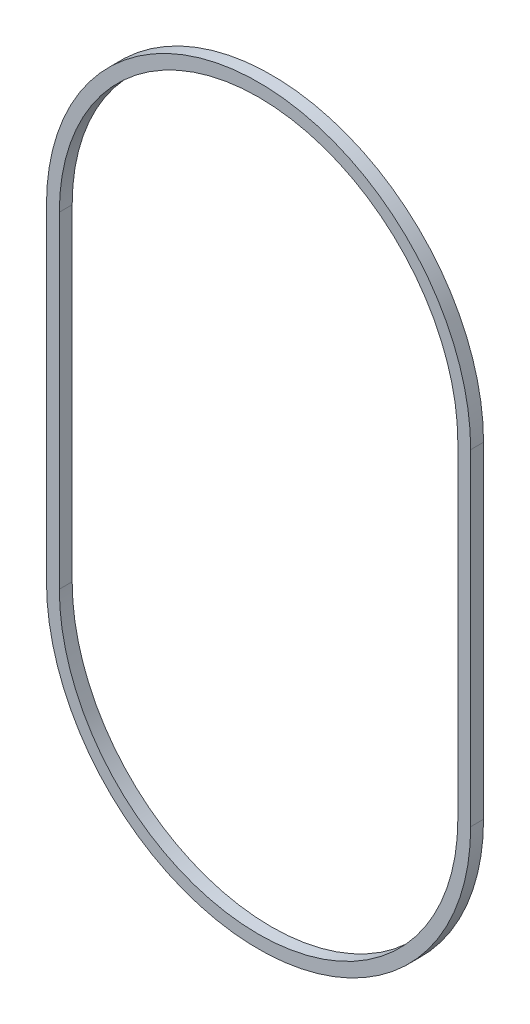
ISO-10303-21;
HEADER;
FILE_DESCRIPTION(('STEP AP214'),'2;1');
FILE_NAME('part.step','',(''),(''),'','','');
FILE_SCHEMA(('AUTOMOTIVE_DESIGN { 1 0 10303 214 1 1 1 1 }'));
ENDSEC;
DATA;
#1=APPLICATION_CONTEXT('core data for automotive mechanical design processes');
#2=APPLICATION_PROTOCOL_DEFINITION('international standard','automotive_design',2000,#1);
#3=PRODUCT_CONTEXT('',#1,'mechanical');
#4=PRODUCT('Part','Part','',(#3));
#5=PRODUCT_RELATED_PRODUCT_CATEGORY('part','',(#4));
#6=PRODUCT_DEFINITION_FORMATION('','',#4);
#7=PRODUCT_DEFINITION_CONTEXT('part definition',#1,'design');
#8=PRODUCT_DEFINITION('design','',#6,#7);
#9=PRODUCT_DEFINITION_SHAPE('','',#8);
#10=(LENGTH_UNIT() NAMED_UNIT(*) SI_UNIT(.MILLI.,.METRE.));
#11=(NAMED_UNIT(*) PLANE_ANGLE_UNIT() SI_UNIT($,.RADIAN.));
#12=(NAMED_UNIT(*) SI_UNIT($,.STERADIAN.) SOLID_ANGLE_UNIT());
#13=UNCERTAINTY_MEASURE_WITH_UNIT(LENGTH_MEASURE(1.E-05),#10,'distance_accuracy_value','');
#14=(GEOMETRIC_REPRESENTATION_CONTEXT(3) GLOBAL_UNCERTAINTY_ASSIGNED_CONTEXT((#13)) GLOBAL_UNIT_ASSIGNED_CONTEXT((#10,
#11,#12)) REPRESENTATION_CONTEXT('',''));
#15=CARTESIAN_POINT('',(0.,0.,0.));
#16=DIRECTION('',(0.,0.,1.));
#17=DIRECTION('',(1.,0.,0.));
#18=AXIS2_PLACEMENT_3D('',#15,#16,#17);
#19=CARTESIAN_POINT('',(0.,-31.75,2.5));
#20=DIRECTION('',(0.,0.,1.));
#21=DIRECTION('',(1.,0.,0.));
#22=AXIS2_PLACEMENT_3D('',#19,#20,#21);
#23=PLANE('',#22);
#24=CARTESIAN_POINT('',(0.,-31.75,2.5));
#25=DIRECTION('',(0.,0.,1.));
#26=DIRECTION('',(1.,0.,0.));
#27=AXIS2_PLACEMENT_3D('',#24,#25,#26);
#28=CIRCLE('',#27,41.25);
#29=CARTESIAN_POINT('',(-41.25,-31.75,2.5));
#30=VERTEX_POINT('',#29);
#31=CARTESIAN_POINT('',(41.25,-31.75,2.5));
#32=VERTEX_POINT('',#31);
#33=EDGE_CURVE('E140',#30,#32,#28,.T.);
#34=ORIENTED_EDGE('',*,*,#33,.T.);
#35=DIRECTION('',(0.,1.,0.));
#36=VECTOR('',#35,1.);
#37=CARTESIAN_POINT('',(41.25,-31.75,2.5));
#38=LINE('',#37,#36);
#39=CARTESIAN_POINT('',(41.25,31.75,2.5));
#40=VERTEX_POINT('',#39);
#41=EDGE_CURVE('E143',#32,#40,#38,.T.);
#42=ORIENTED_EDGE('',*,*,#41,.T.);
#43=CARTESIAN_POINT('',(0.,31.75,2.5));
#44=DIRECTION('',(0.,0.,1.));
#45=DIRECTION('',(1.,0.,0.));
#46=AXIS2_PLACEMENT_3D('',#43,#44,#45);
#47=CIRCLE('',#46,41.25);
#48=CARTESIAN_POINT('',(-41.25,31.75,2.5));
#49=VERTEX_POINT('',#48);
#50=EDGE_CURVE('E146',#40,#49,#47,.T.);
#51=ORIENTED_EDGE('',*,*,#50,.T.);
#52=DIRECTION('',(0.,-1.,0.));
#53=VECTOR('',#52,1.);
#54=CARTESIAN_POINT('',(-41.25,-31.75,2.5));
#55=LINE('',#54,#53);
#56=EDGE_CURVE('E148',#49,#30,#55,.T.);
#57=ORIENTED_EDGE('',*,*,#56,.T.);
#58=EDGE_LOOP('',(#34,#42,#51,#57));
#59=FACE_BOUND('',#58,.T.);
#60=DIRECTION('',(0.,1.,0.));
#61=VECTOR('',#60,1.);
#62=CARTESIAN_POINT('',(38.75,-31.75,2.5));
#63=LINE('',#62,#61);
#64=CARTESIAN_POINT('',(38.75,-31.75,2.5));
#65=VERTEX_POINT('',#64);
#66=CARTESIAN_POINT('',(38.75,31.75,2.5));
#67=VERTEX_POINT('',#66);
#68=EDGE_CURVE('E112',#65,#67,#63,.T.);
#69=ORIENTED_EDGE('',*,*,#68,.F.);
#70=CARTESIAN_POINT('',(0.,-31.75,2.5));
#71=DIRECTION('',(0.,0.,1.));
#72=DIRECTION('',(1.,0.,0.));
#73=AXIS2_PLACEMENT_3D('',#70,#71,#72);
#74=CIRCLE('',#73,38.75);
#75=CARTESIAN_POINT('',(-38.75,-31.75,2.5));
#76=VERTEX_POINT('',#75);
#77=EDGE_CURVE('E104',#76,#65,#74,.T.);
#78=ORIENTED_EDGE('',*,*,#77,.F.);
#79=DIRECTION('',(0.,-1.,0.));
#80=VECTOR('',#79,1.);
#81=CARTESIAN_POINT('',(-38.75,-31.75,2.5));
#82=LINE('',#81,#80);
#83=CARTESIAN_POINT('',(-38.75,31.75,2.5));
#84=VERTEX_POINT('',#83);
#85=EDGE_CURVE('E126',#84,#76,#82,.T.);
#86=ORIENTED_EDGE('',*,*,#85,.F.);
#87=CARTESIAN_POINT('',(0.,31.75,2.5));
#88=DIRECTION('',(0.,0.,1.));
#89=DIRECTION('',(1.,0.,0.));
#90=AXIS2_PLACEMENT_3D('',#87,#88,#89);
#91=CIRCLE('',#90,38.75);
#92=EDGE_CURVE('E124',#67,#84,#91,.T.);
#93=ORIENTED_EDGE('',*,*,#92,.F.);
#94=EDGE_LOOP('',(#69,#78,#86,#93));
#95=FACE_BOUND('',#94,.T.);
#96=ADVANCED_FACE('F39',(#59,#95),#23,.T.);
#97=CARTESIAN_POINT('',(0.,-31.75,0.));
#98=DIRECTION('',(0.,0.,1.));
#99=DIRECTION('',(1.,0.,0.));
#100=AXIS2_PLACEMENT_3D('',#97,#98,#99);
#101=PLANE('',#100);
#102=CARTESIAN_POINT('',(0.,-31.75,0.));
#103=DIRECTION('',(0.,0.,1.));
#104=DIRECTION('',(1.,0.,0.));
#105=AXIS2_PLACEMENT_3D('',#102,#103,#104);
#106=CIRCLE('',#105,41.25);
#107=CARTESIAN_POINT('',(-41.25,-31.75,0.));
#108=VERTEX_POINT('',#107);
#109=CARTESIAN_POINT('',(41.25,-31.75,0.));
#110=VERTEX_POINT('',#109);
#111=EDGE_CURVE('E120',#108,#110,#106,.T.);
#112=ORIENTED_EDGE('',*,*,#111,.F.);
#113=DIRECTION('',(0.,-1.,0.));
#114=VECTOR('',#113,1.);
#115=CARTESIAN_POINT('',(-41.25,-31.75,0.));
#116=LINE('',#115,#114);
#117=CARTESIAN_POINT('',(-41.25,31.75,0.));
#118=VERTEX_POINT('',#117);
#119=EDGE_CURVE('E144',#118,#108,#116,.T.);
#120=ORIENTED_EDGE('',*,*,#119,.F.);
#121=CARTESIAN_POINT('',(0.,31.75,0.));
#122=DIRECTION('',(0.,0.,1.));
#123=DIRECTION('',(1.,0.,0.));
#124=AXIS2_PLACEMENT_3D('',#121,#122,#123);
#125=CIRCLE('',#124,41.25);
#126=CARTESIAN_POINT('',(41.25,31.75,0.));
#127=VERTEX_POINT('',#126);
#128=EDGE_CURVE('E155',#127,#118,#125,.T.);
#129=ORIENTED_EDGE('',*,*,#128,.F.);
#130=DIRECTION('',(0.,1.,0.));
#131=VECTOR('',#130,1.);
#132=CARTESIAN_POINT('',(41.25,-31.75,0.));
#133=LINE('',#132,#131);
#134=EDGE_CURVE('E153',#110,#127,#133,.T.);
#135=ORIENTED_EDGE('',*,*,#134,.F.);
#136=EDGE_LOOP('',(#112,#120,#129,#135));
#137=FACE_BOUND('',#136,.T.);
#138=CARTESIAN_POINT('',(0.,-31.75,0.));
#139=DIRECTION('',(0.,0.,1.));
#140=DIRECTION('',(1.,0.,0.));
#141=AXIS2_PLACEMENT_3D('',#138,#139,#140);
#142=CIRCLE('',#141,38.75);
#143=CARTESIAN_POINT('',(-38.75,-31.75,0.));
#144=VERTEX_POINT('',#143);
#145=CARTESIAN_POINT('',(38.75,-31.75,0.));
#146=VERTEX_POINT('',#145);
#147=EDGE_CURVE('E62',#144,#146,#142,.T.);
#148=ORIENTED_EDGE('',*,*,#147,.T.);
#149=DIRECTION('',(0.,1.,0.));
#150=VECTOR('',#149,1.);
#151=CARTESIAN_POINT('',(38.75,-31.75,0.));
#152=LINE('',#151,#150);
#153=CARTESIAN_POINT('',(38.75,31.75,0.));
#154=VERTEX_POINT('',#153);
#155=EDGE_CURVE('E119',#146,#154,#152,.T.);
#156=ORIENTED_EDGE('',*,*,#155,.T.);
#157=CARTESIAN_POINT('',(0.,31.75,0.));
#158=DIRECTION('',(0.,0.,1.));
#159=DIRECTION('',(1.,0.,0.));
#160=AXIS2_PLACEMENT_3D('',#157,#158,#159);
#161=CIRCLE('',#160,38.75);
#162=CARTESIAN_POINT('',(-38.75,31.75,0.));
#163=VERTEX_POINT('',#162);
#164=EDGE_CURVE('E132',#154,#163,#161,.T.);
#165=ORIENTED_EDGE('',*,*,#164,.T.);
#166=DIRECTION('',(0.,-1.,0.));
#167=VECTOR('',#166,1.);
#168=CARTESIAN_POINT('',(-38.75,-31.75,0.));
#169=LINE('',#168,#167);
#170=EDGE_CURVE('E113',#163,#144,#169,.T.);
#171=ORIENTED_EDGE('',*,*,#170,.T.);
#172=EDGE_LOOP('',(#148,#156,#165,#171));
#173=FACE_BOUND('',#172,.T.);
#174=ADVANCED_FACE('F173',(#137,#173),#101,.F.);
#175=CARTESIAN_POINT('',(0.,-31.75,2.5));
#176=DIRECTION('',(0.,0.,-1.));
#177=DIRECTION('',(-1.,0.,0.));
#178=AXIS2_PLACEMENT_3D('',#175,#176,#177);
#179=CYLINDRICAL_SURFACE('',#178,41.25);
#180=ORIENTED_EDGE('',*,*,#111,.T.);
#181=DIRECTION('',(0.,0.,-1.));
#182=VECTOR('',#181,1.);
#183=CARTESIAN_POINT('',(41.25,-31.75,2.5));
#184=LINE('',#183,#182);
#185=EDGE_CURVE('E11',#32,#110,#184,.T.);
#186=ORIENTED_EDGE('',*,*,#185,.F.);
#187=ORIENTED_EDGE('',*,*,#33,.F.);
#188=DIRECTION('',(0.,0.,-1.));
#189=VECTOR('',#188,1.);
#190=CARTESIAN_POINT('',(-41.25,-31.75,2.5));
#191=LINE('',#190,#189);
#192=EDGE_CURVE('E150',#30,#108,#191,.T.);
#193=ORIENTED_EDGE('',*,*,#192,.T.);
#194=EDGE_LOOP('',(#180,#186,#187,#193));
#195=FACE_BOUND('',#194,.T.);
#196=ADVANCED_FACE('F41',(#195),#179,.T.);
#197=CARTESIAN_POINT('',(41.25,-31.75,2.5));
#198=DIRECTION('',(-1.,0.,0.));
#199=DIRECTION('',(0.,0.,1.));
#200=AXIS2_PLACEMENT_3D('',#197,#198,#199);
#201=PLANE('',#200);
#202=ORIENTED_EDGE('',*,*,#134,.T.);
#203=DIRECTION('',(0.,0.,-1.));
#204=VECTOR('',#203,1.);
#205=CARTESIAN_POINT('',(41.25,31.75,2.5));
#206=LINE('',#205,#204);
#207=EDGE_CURVE('E47',#40,#127,#206,.T.);
#208=ORIENTED_EDGE('',*,*,#207,.F.);
#209=ORIENTED_EDGE('',*,*,#41,.F.);
#210=ORIENTED_EDGE('',*,*,#185,.T.);
#211=EDGE_LOOP('',(#202,#208,#209,#210));
#212=FACE_BOUND('',#211,.T.);
#213=ADVANCED_FACE('F183',(#212),#201,.F.);
#214=CARTESIAN_POINT('',(0.,31.75,2.5));
#215=DIRECTION('',(0.,0.,-1.));
#216=DIRECTION('',(-1.,0.,0.));
#217=AXIS2_PLACEMENT_3D('',#214,#215,#216);
#218=CYLINDRICAL_SURFACE('',#217,41.25);
#219=ORIENTED_EDGE('',*,*,#128,.T.);
#220=DIRECTION('',(0.,0.,-1.));
#221=VECTOR('',#220,1.);
#222=CARTESIAN_POINT('',(-41.25,31.75,2.5));
#223=LINE('',#222,#221);
#224=EDGE_CURVE('E160',#49,#118,#223,.T.);
#225=ORIENTED_EDGE('',*,*,#224,.F.);
#226=ORIENTED_EDGE('',*,*,#50,.F.);
#227=ORIENTED_EDGE('',*,*,#207,.T.);
#228=EDGE_LOOP('',(#219,#225,#226,#227));
#229=FACE_BOUND('',#228,.T.);
#230=ADVANCED_FACE('F167',(#229),#218,.T.);
#231=CARTESIAN_POINT('',(-41.25,-31.75,2.5));
#232=DIRECTION('',(1.,0.,0.));
#233=DIRECTION('',(0.,0.,-1.));
#234=AXIS2_PLACEMENT_3D('',#231,#232,#233);
#235=PLANE('',#234);
#236=ORIENTED_EDGE('',*,*,#119,.T.);
#237=ORIENTED_EDGE('',*,*,#192,.F.);
#238=ORIENTED_EDGE('',*,*,#56,.F.);
#239=ORIENTED_EDGE('',*,*,#224,.T.);
#240=EDGE_LOOP('',(#236,#237,#238,#239));
#241=FACE_BOUND('',#240,.T.);
#242=ADVANCED_FACE('F177',(#241),#235,.F.);
#243=CARTESIAN_POINT('',(0.,-31.75,2.5));
#244=DIRECTION('',(0.,0.,-1.));
#245=DIRECTION('',(-1.,0.,0.));
#246=AXIS2_PLACEMENT_3D('',#243,#244,#245);
#247=CYLINDRICAL_SURFACE('',#246,38.75);
#248=ORIENTED_EDGE('',*,*,#147,.F.);
#249=DIRECTION('',(0.,0.,-1.));
#250=VECTOR('',#249,1.);
#251=CARTESIAN_POINT('',(-38.75,-31.75,2.5));
#252=LINE('',#251,#250);
#253=EDGE_CURVE('E108',#76,#144,#252,.T.);
#254=ORIENTED_EDGE('',*,*,#253,.F.);
#255=ORIENTED_EDGE('',*,*,#77,.T.);
#256=DIRECTION('',(0.,0.,-1.));
#257=VECTOR('',#256,1.);
#258=CARTESIAN_POINT('',(38.75,-31.75,2.5));
#259=LINE('',#258,#257);
#260=EDGE_CURVE('E107',#65,#146,#259,.T.);
#261=ORIENTED_EDGE('',*,*,#260,.T.);
#262=EDGE_LOOP('',(#248,#254,#255,#261));
#263=FACE_BOUND('',#262,.T.);
#264=ADVANCED_FACE('F106',(#263),#247,.F.);
#265=CARTESIAN_POINT('',(38.75,-31.75,2.5));
#266=DIRECTION('',(-1.,0.,0.));
#267=DIRECTION('',(0.,-1.,0.));
#268=AXIS2_PLACEMENT_3D('',#265,#266,#267);
#269=PLANE('',#268);
#270=ORIENTED_EDGE('',*,*,#155,.F.);
#271=ORIENTED_EDGE('',*,*,#260,.F.);
#272=ORIENTED_EDGE('',*,*,#68,.T.);
#273=DIRECTION('',(0.,0.,-1.));
#274=VECTOR('',#273,1.);
#275=CARTESIAN_POINT('',(38.75,31.75,2.5));
#276=LINE('',#275,#274);
#277=EDGE_CURVE('E121',#67,#154,#276,.T.);
#278=ORIENTED_EDGE('',*,*,#277,.T.);
#279=EDGE_LOOP('',(#270,#271,#272,#278));
#280=FACE_BOUND('',#279,.T.);
#281=ADVANCED_FACE('F116',(#280),#269,.T.);
#282=CARTESIAN_POINT('',(0.,31.75,2.5));
#283=DIRECTION('',(0.,0.,-1.));
#284=DIRECTION('',(-1.,0.,0.));
#285=AXIS2_PLACEMENT_3D('',#282,#283,#284);
#286=CYLINDRICAL_SURFACE('',#285,38.75);
#287=ORIENTED_EDGE('',*,*,#164,.F.);
#288=ORIENTED_EDGE('',*,*,#277,.F.);
#289=ORIENTED_EDGE('',*,*,#92,.T.);
#290=DIRECTION('',(0.,0.,-1.));
#291=VECTOR('',#290,1.);
#292=CARTESIAN_POINT('',(-38.75,31.75,2.5));
#293=LINE('',#292,#291);
#294=EDGE_CURVE('E54',#84,#163,#293,.T.);
#295=ORIENTED_EDGE('',*,*,#294,.T.);
#296=EDGE_LOOP('',(#287,#288,#289,#295));
#297=FACE_BOUND('',#296,.T.);
#298=ADVANCED_FACE('F206',(#297),#286,.F.);
#299=CARTESIAN_POINT('',(-38.75,-31.75,2.5));
#300=DIRECTION('',(1.,0.,0.));
#301=DIRECTION('',(0.,1.,0.));
#302=AXIS2_PLACEMENT_3D('',#299,#300,#301);
#303=PLANE('',#302);
#304=ORIENTED_EDGE('',*,*,#170,.F.);
#305=ORIENTED_EDGE('',*,*,#294,.F.);
#306=ORIENTED_EDGE('',*,*,#85,.T.);
#307=ORIENTED_EDGE('',*,*,#253,.T.);
#308=EDGE_LOOP('',(#304,#305,#306,#307));
#309=FACE_BOUND('',#308,.T.);
#310=ADVANCED_FACE('F210',(#309),#303,.T.);
#311=CLOSED_SHELL('',(#96,#174,#196,#213,#230,#242,#264,#281,#298,#310));
#312=MANIFOLD_SOLID_BREP('B2',#311);
#313=ADVANCED_BREP_SHAPE_REPRESENTATION('',(#18,#312),#14);
#314=SHAPE_DEFINITION_REPRESENTATION(#9,#313);
ENDSEC;
END-ISO-10303-21;
